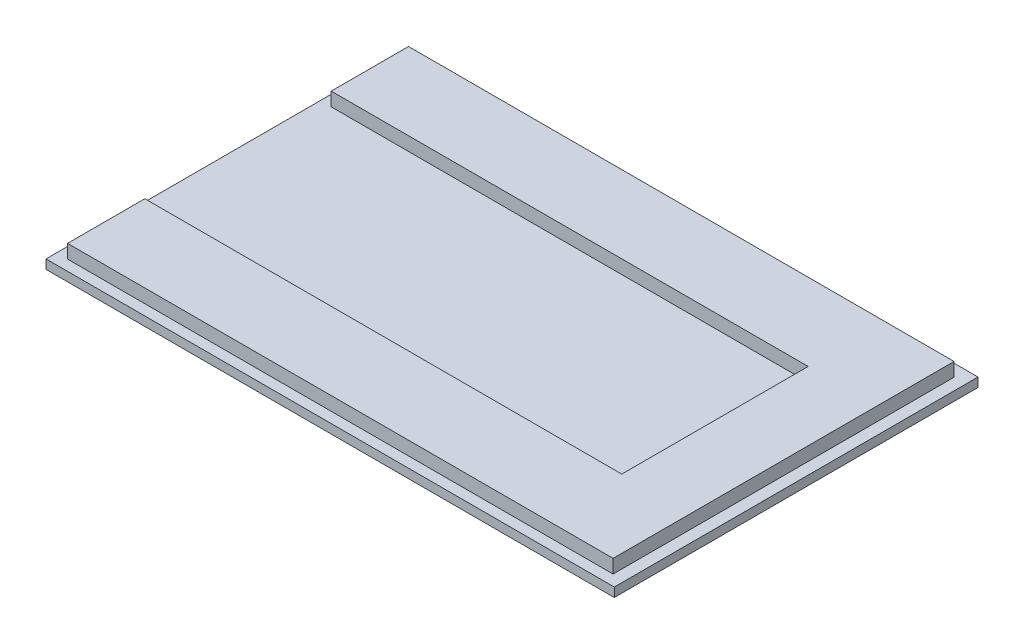
ISO-10303-21;
HEADER;
FILE_DESCRIPTION(('STEP AP214'),'2;1');
FILE_NAME('part.step','',(''),(''),'','','');
FILE_SCHEMA(('AUTOMOTIVE_DESIGN { 1 0 10303 214 1 1 1 1 }'));
ENDSEC;
DATA;
#1=APPLICATION_CONTEXT('core data for automotive mechanical design processes');
#2=APPLICATION_PROTOCOL_DEFINITION('international standard','automotive_design',2000,#1);
#3=PRODUCT_CONTEXT('',#1,'mechanical');
#4=PRODUCT('Part','Part','',(#3));
#5=PRODUCT_RELATED_PRODUCT_CATEGORY('part','',(#4));
#6=PRODUCT_DEFINITION_FORMATION('','',#4);
#7=PRODUCT_DEFINITION_CONTEXT('part definition',#1,'design');
#8=PRODUCT_DEFINITION('design','',#6,#7);
#9=PRODUCT_DEFINITION_SHAPE('','',#8);
#10=(LENGTH_UNIT() NAMED_UNIT(*) SI_UNIT(.MILLI.,.METRE.));
#11=(NAMED_UNIT(*) PLANE_ANGLE_UNIT() SI_UNIT($,.RADIAN.));
#12=(NAMED_UNIT(*) SI_UNIT($,.STERADIAN.) SOLID_ANGLE_UNIT());
#13=UNCERTAINTY_MEASURE_WITH_UNIT(LENGTH_MEASURE(1.E-05),#10,'distance_accuracy_value','');
#14=(GEOMETRIC_REPRESENTATION_CONTEXT(3) GLOBAL_UNCERTAINTY_ASSIGNED_CONTEXT((#13)) GLOBAL_UNIT_ASSIGNED_CONTEXT((#10,
#11,#12)) REPRESENTATION_CONTEXT('',''));
#15=CARTESIAN_POINT('',(0.,0.,0.));
#16=DIRECTION('',(0.,0.,1.));
#17=DIRECTION('',(1.,0.,0.));
#18=AXIS2_PLACEMENT_3D('',#15,#16,#17);
#19=CARTESIAN_POINT('',(2.40382047502787,5.,-77.3360349520913));
#20=DIRECTION('',(1.,0.,0.));
#21=DIRECTION('',(0.,0.,-1.));
#22=AXIS2_PLACEMENT_3D('',#19,#20,#21);
#23=PLANE('',#22);
#24=DIRECTION('',(0.,0.,1.));
#25=VECTOR('',#24,1.);
#26=CARTESIAN_POINT('',(2.40382047502787,2.,-77.3360349520913));
#27=LINE('',#26,#25);
#28=CARTESIAN_POINT('',(2.40382047502787,2.,-77.3360349520913));
#29=VERTEX_POINT('',#28);
#30=CARTESIAN_POINT('',(2.40382047502787,2.,-60.3360349520913));
#31=VERTEX_POINT('',#30);
#32=EDGE_CURVE('E56',#29,#31,#27,.T.);
#33=ORIENTED_EDGE('',*,*,#32,.T.);
#34=DIRECTION('',(0.,1.,0.));
#35=VECTOR('',#34,1.);
#36=CARTESIAN_POINT('',(2.40382047502787,2.,-60.3360349520913));
#37=LINE('',#36,#35);
#38=CARTESIAN_POINT('',(2.40382047502787,5.,-60.3360349520913));
#39=VERTEX_POINT('',#38);
#40=EDGE_CURVE('E144',#31,#39,#37,.T.);
#41=ORIENTED_EDGE('',*,*,#40,.T.);
#42=DIRECTION('',(0.,0.,1.));
#43=VECTOR('',#42,1.);
#44=CARTESIAN_POINT('',(2.40382047502787,5.,-77.3360349520913));
#45=LINE('',#44,#43);
#46=CARTESIAN_POINT('',(2.40382047502787,5.,-77.3360349520913));
#47=VERTEX_POINT('',#46);
#48=EDGE_CURVE('E333',#47,#39,#45,.T.);
#49=ORIENTED_EDGE('',*,*,#48,.F.);
#50=DIRECTION('',(0.,-1.,0.));
#51=VECTOR('',#50,1.);
#52=CARTESIAN_POINT('',(2.40382047502787,5.,-77.3360349520913));
#53=LINE('',#52,#51);
#54=EDGE_CURVE('E159',#47,#29,#53,.T.);
#55=ORIENTED_EDGE('',*,*,#54,.T.);
#56=EDGE_LOOP('',(#33,#41,#49,#55));
#57=FACE_BOUND('',#56,.T.);
#58=ADVANCED_FACE('F33',(#57),#23,.F.);
#59=CARTESIAN_POINT('',(0.,2.,0.));
#60=DIRECTION('',(0.,-1.,0.));
#61=DIRECTION('',(0.,0.,-1.));
#62=AXIS2_PLACEMENT_3D('',#59,#60,#61);
#63=PLANE('',#62);
#64=DIRECTION('',(0.,0.,1.));
#65=VECTOR('',#64,1.);
#66=CARTESIAN_POINT('',(0.,2.,0.));
#67=LINE('',#66,#65);
#68=CARTESIAN_POINT('',(0.,2.,-80.));
#69=VERTEX_POINT('',#68);
#70=CARTESIAN_POINT('',(0.,2.,0.));
#71=VERTEX_POINT('',#70);
#72=EDGE_CURVE('E171',#69,#71,#67,.T.);
#73=ORIENTED_EDGE('',*,*,#72,.T.);
#74=DIRECTION('',(1.,0.,0.));
#75=VECTOR('',#74,1.);
#76=CARTESIAN_POINT('',(0.,2.,0.));
#77=LINE('',#76,#75);
#78=CARTESIAN_POINT('',(125.,2.,0.));
#79=VERTEX_POINT('',#78);
#80=EDGE_CURVE('E174',#71,#79,#77,.T.);
#81=ORIENTED_EDGE('',*,*,#80,.T.);
#82=DIRECTION('',(0.,0.,-1.));
#83=VECTOR('',#82,1.);
#84=CARTESIAN_POINT('',(125.,2.,0.));
#85=LINE('',#84,#83);
#86=CARTESIAN_POINT('',(125.,2.,-80.));
#87=VERTEX_POINT('',#86);
#88=EDGE_CURVE('E177',#79,#87,#85,.T.);
#89=ORIENTED_EDGE('',*,*,#88,.T.);
#90=DIRECTION('',(-1.,0.,0.));
#91=VECTOR('',#90,1.);
#92=CARTESIAN_POINT('',(0.,2.,-80.));
#93=LINE('',#92,#91);
#94=EDGE_CURVE('E179',#87,#69,#93,.T.);
#95=ORIENTED_EDGE('',*,*,#94,.T.);
#96=EDGE_LOOP('',(#73,#81,#89,#95));
#97=FACE_BOUND('',#96,.T.);
#98=ORIENTED_EDGE('',*,*,#32,.F.);
#99=DIRECTION('',(-1.,0.,0.));
#100=VECTOR('',#99,1.);
#101=CARTESIAN_POINT('',(2.40382047502787,2.,-77.3360349520913));
#102=LINE('',#101,#100);
#103=CARTESIAN_POINT('',(122.403820475028,2.,-77.3360349520913));
#104=VERTEX_POINT('',#103);
#105=EDGE_CURVE('E157',#104,#29,#102,.T.);
#106=ORIENTED_EDGE('',*,*,#105,.F.);
#107=DIRECTION('',(0.,0.,-1.));
#108=VECTOR('',#107,1.);
#109=CARTESIAN_POINT('',(122.403820475028,2.,-77.3360349520913));
#110=LINE('',#109,#108);
#111=CARTESIAN_POINT('',(122.403820475028,2.,-2.33603495209132));
#112=VERTEX_POINT('',#111);
#113=EDGE_CURVE('E154',#112,#104,#110,.T.);
#114=ORIENTED_EDGE('',*,*,#113,.F.);
#115=DIRECTION('',(1.,0.,0.));
#116=VECTOR('',#115,1.);
#117=CARTESIAN_POINT('',(2.40382047502787,2.,-2.33603495209132));
#118=LINE('',#117,#116);
#119=CARTESIAN_POINT('',(2.40382047502787,2.,-2.33603495209132));
#120=VERTEX_POINT('',#119);
#121=EDGE_CURVE('E142',#120,#112,#118,.T.);
#122=ORIENTED_EDGE('',*,*,#121,.F.);
#123=CARTESIAN_POINT('',(2.40382047502787,2.,-19.3360349520913));
#124=VERTEX_POINT('',#123);
#125=EDGE_CURVE('E135',#124,#120,#27,.T.);
#126=ORIENTED_EDGE('',*,*,#125,.F.);
#127=DIRECTION('',(1.,0.,0.));
#128=VECTOR('',#127,1.);
#129=CARTESIAN_POINT('',(2.40382047502787,2.,-19.3360349520913));
#130=LINE('',#129,#128);
#131=CARTESIAN_POINT('',(107.308275896382,2.,-19.3360349520913));
#132=VERTEX_POINT('',#131);
#133=EDGE_CURVE('E122',#124,#132,#130,.T.);
#134=ORIENTED_EDGE('',*,*,#133,.T.);
#135=DIRECTION('',(0.,0.,-1.));
#136=VECTOR('',#135,1.);
#137=CARTESIAN_POINT('',(107.308275896382,2.,-60.3360349520913));
#138=LINE('',#137,#136);
#139=CARTESIAN_POINT('',(107.308275896382,2.,-60.3360349520913));
#140=VERTEX_POINT('',#139);
#141=EDGE_CURVE('E128',#132,#140,#138,.T.);
#142=ORIENTED_EDGE('',*,*,#141,.T.);
#143=DIRECTION('',(-1.,0.,0.));
#144=VECTOR('',#143,1.);
#145=CARTESIAN_POINT('',(2.40382047502787,2.,-60.3360349520913));
#146=LINE('',#145,#144);
#147=EDGE_CURVE('E138',#140,#31,#146,.T.);
#148=ORIENTED_EDGE('',*,*,#147,.T.);
#149=EDGE_LOOP('',(#98,#106,#114,#122,#126,#134,#142,#148));
#150=FACE_BOUND('',#149,.T.);
#151=ADVANCED_FACE('F140',(#97,#150),#63,.F.);
#152=CARTESIAN_POINT('',(0.,2.,0.));
#153=DIRECTION('',(1.,0.,0.));
#154=DIRECTION('',(0.,0.,-1.));
#155=AXIS2_PLACEMENT_3D('',#152,#153,#154);
#156=PLANE('',#155);
#157=DIRECTION('',(0.,0.,1.));
#158=VECTOR('',#157,1.);
#159=CARTESIAN_POINT('',(0.,0.,0.));
#160=LINE('',#159,#158);
#161=CARTESIAN_POINT('',(0.,0.,-80.));
#162=VERTEX_POINT('',#161);
#163=CARTESIAN_POINT('',(0.,0.,0.));
#164=VERTEX_POINT('',#163);
#165=EDGE_CURVE('E170',#162,#164,#160,.T.);
#166=ORIENTED_EDGE('',*,*,#165,.T.);
#167=DIRECTION('',(0.,-1.,0.));
#168=VECTOR('',#167,1.);
#169=CARTESIAN_POINT('',(0.,2.,0.));
#170=LINE('',#169,#168);
#171=EDGE_CURVE('E11',#71,#164,#170,.T.);
#172=ORIENTED_EDGE('',*,*,#171,.F.);
#173=ORIENTED_EDGE('',*,*,#72,.F.);
#174=DIRECTION('',(0.,-1.,0.));
#175=VECTOR('',#174,1.);
#176=CARTESIAN_POINT('',(0.,2.,-80.));
#177=LINE('',#176,#175);
#178=EDGE_CURVE('E181',#69,#162,#177,.T.);
#179=ORIENTED_EDGE('',*,*,#178,.T.);
#180=EDGE_LOOP('',(#166,#172,#173,#179));
#181=FACE_BOUND('',#180,.T.);
#182=ADVANCED_FACE('F35',(#181),#156,.F.);
#183=CARTESIAN_POINT('',(0.,2.,0.));
#184=DIRECTION('',(0.,0.,-1.));
#185=DIRECTION('',(-1.,0.,0.));
#186=AXIS2_PLACEMENT_3D('',#183,#184,#185);
#187=PLANE('',#186);
#188=DIRECTION('',(1.,0.,0.));
#189=VECTOR('',#188,1.);
#190=CARTESIAN_POINT('',(0.,0.,0.));
#191=LINE('',#190,#189);
#192=CARTESIAN_POINT('',(125.,0.,0.));
#193=VERTEX_POINT('',#192);
#194=EDGE_CURVE('E184',#164,#193,#191,.T.);
#195=ORIENTED_EDGE('',*,*,#194,.T.);
#196=DIRECTION('',(0.,-1.,0.));
#197=VECTOR('',#196,1.);
#198=CARTESIAN_POINT('',(125.,2.,0.));
#199=LINE('',#198,#197);
#200=EDGE_CURVE('E41',#79,#193,#199,.T.);
#201=ORIENTED_EDGE('',*,*,#200,.F.);
#202=ORIENTED_EDGE('',*,*,#80,.F.);
#203=ORIENTED_EDGE('',*,*,#171,.T.);
#204=EDGE_LOOP('',(#195,#201,#202,#203));
#205=FACE_BOUND('',#204,.T.);
#206=ADVANCED_FACE('F213',(#205),#187,.F.);
#207=CARTESIAN_POINT('',(125.,2.,0.));
#208=DIRECTION('',(-1.,0.,0.));
#209=DIRECTION('',(0.,0.,1.));
#210=AXIS2_PLACEMENT_3D('',#207,#208,#209);
#211=PLANE('',#210);
#212=DIRECTION('',(0.,0.,-1.));
#213=VECTOR('',#212,1.);
#214=CARTESIAN_POINT('',(125.,0.,0.));
#215=LINE('',#214,#213);
#216=CARTESIAN_POINT('',(125.,0.,-80.));
#217=VERTEX_POINT('',#216);
#218=EDGE_CURVE('E186',#193,#217,#215,.T.);
#219=ORIENTED_EDGE('',*,*,#218,.T.);
#220=DIRECTION('',(0.,-1.,0.));
#221=VECTOR('',#220,1.);
#222=CARTESIAN_POINT('',(125.,2.,-80.));
#223=LINE('',#222,#221);
#224=EDGE_CURVE('E191',#87,#217,#223,.T.);
#225=ORIENTED_EDGE('',*,*,#224,.F.);
#226=ORIENTED_EDGE('',*,*,#88,.F.);
#227=ORIENTED_EDGE('',*,*,#200,.T.);
#228=EDGE_LOOP('',(#219,#225,#226,#227));
#229=FACE_BOUND('',#228,.T.);
#230=ADVANCED_FACE('F198',(#229),#211,.F.);
#231=CARTESIAN_POINT('',(0.,2.,-80.));
#232=DIRECTION('',(0.,0.,1.));
#233=DIRECTION('',(1.,0.,0.));
#234=AXIS2_PLACEMENT_3D('',#231,#232,#233);
#235=PLANE('',#234);
#236=DIRECTION('',(-1.,0.,0.));
#237=VECTOR('',#236,1.);
#238=CARTESIAN_POINT('',(0.,0.,-80.));
#239=LINE('',#238,#237);
#240=EDGE_CURVE('E175',#217,#162,#239,.T.);
#241=ORIENTED_EDGE('',*,*,#240,.T.);
#242=ORIENTED_EDGE('',*,*,#178,.F.);
#243=ORIENTED_EDGE('',*,*,#94,.F.);
#244=ORIENTED_EDGE('',*,*,#224,.T.);
#245=EDGE_LOOP('',(#241,#242,#243,#244));
#246=FACE_BOUND('',#245,.T.);
#247=ADVANCED_FACE('F207',(#246),#235,.F.);
#248=CARTESIAN_POINT('',(0.,0.,0.));
#249=DIRECTION('',(0.,-1.,0.));
#250=DIRECTION('',(0.,0.,-1.));
#251=AXIS2_PLACEMENT_3D('',#248,#249,#250);
#252=PLANE('',#251);
#253=ORIENTED_EDGE('',*,*,#165,.F.);
#254=ORIENTED_EDGE('',*,*,#240,.F.);
#255=ORIENTED_EDGE('',*,*,#218,.F.);
#256=ORIENTED_EDGE('',*,*,#194,.F.);
#257=EDGE_LOOP('',(#253,#254,#255,#256));
#258=FACE_BOUND('',#257,.T.);
#259=ADVANCED_FACE('F204',(#258),#252,.T.);
#260=CARTESIAN_POINT('',(2.40382047502787,5.,-19.3360349520913));
#261=VERTEX_POINT('',#260);
#262=CARTESIAN_POINT('',(2.40382047502787,5.,-2.33603495209132));
#263=VERTEX_POINT('',#262);
#264=EDGE_CURVE('E137',#261,#263,#45,.T.);
#265=ORIENTED_EDGE('',*,*,#264,.F.);
#266=DIRECTION('',(0.,1.,0.));
#267=VECTOR('',#266,1.);
#268=CARTESIAN_POINT('',(2.40382047502787,2.,-19.3360349520913));
#269=LINE('',#268,#267);
#270=EDGE_CURVE('E48',#124,#261,#269,.T.);
#271=ORIENTED_EDGE('',*,*,#270,.F.);
#272=ORIENTED_EDGE('',*,*,#125,.T.);
#273=DIRECTION('',(0.,-1.,0.));
#274=VECTOR('',#273,1.);
#275=CARTESIAN_POINT('',(2.40382047502787,5.,-2.33603495209132));
#276=LINE('',#275,#274);
#277=EDGE_CURVE('E168',#263,#120,#276,.T.);
#278=ORIENTED_EDGE('',*,*,#277,.F.);
#279=EDGE_LOOP('',(#265,#271,#272,#278));
#280=FACE_BOUND('',#279,.T.);
#281=ADVANCED_FACE('F133',(#280),#23,.F.);
#282=CARTESIAN_POINT('',(2.40382047502787,5.,-2.33603495209132));
#283=DIRECTION('',(0.,0.,-1.));
#284=DIRECTION('',(-1.,0.,0.));
#285=AXIS2_PLACEMENT_3D('',#282,#283,#284);
#286=PLANE('',#285);
#287=ORIENTED_EDGE('',*,*,#121,.T.);
#288=DIRECTION('',(0.,-1.,0.));
#289=VECTOR('',#288,1.);
#290=CARTESIAN_POINT('',(122.403820475028,5.,-2.33603495209132));
#291=LINE('',#290,#289);
#292=CARTESIAN_POINT('',(122.403820475028,5.,-2.33603495209132));
#293=VERTEX_POINT('',#292);
#294=EDGE_CURVE('E165',#293,#112,#291,.T.);
#295=ORIENTED_EDGE('',*,*,#294,.F.);
#296=DIRECTION('',(1.,0.,0.));
#297=VECTOR('',#296,1.);
#298=CARTESIAN_POINT('',(2.40382047502787,5.,-2.33603495209132));
#299=LINE('',#298,#297);
#300=EDGE_CURVE('E332',#263,#293,#299,.T.);
#301=ORIENTED_EDGE('',*,*,#300,.F.);
#302=ORIENTED_EDGE('',*,*,#277,.T.);
#303=EDGE_LOOP('',(#287,#295,#301,#302));
#304=FACE_BOUND('',#303,.T.);
#305=ADVANCED_FACE('F229',(#304),#286,.F.);
#306=CARTESIAN_POINT('',(122.403820475028,5.,-77.3360349520913));
#307=DIRECTION('',(-1.,0.,0.));
#308=DIRECTION('',(0.,0.,1.));
#309=AXIS2_PLACEMENT_3D('',#306,#307,#308);
#310=PLANE('',#309);
#311=ORIENTED_EDGE('',*,*,#113,.T.);
#312=DIRECTION('',(0.,-1.,0.));
#313=VECTOR('',#312,1.);
#314=CARTESIAN_POINT('',(122.403820475028,5.,-77.3360349520913));
#315=LINE('',#314,#313);
#316=CARTESIAN_POINT('',(122.403820475028,5.,-77.3360349520913));
#317=VERTEX_POINT('',#316);
#318=EDGE_CURVE('E162',#317,#104,#315,.T.);
#319=ORIENTED_EDGE('',*,*,#318,.F.);
#320=DIRECTION('',(0.,0.,-1.));
#321=VECTOR('',#320,1.);
#322=CARTESIAN_POINT('',(122.403820475028,5.,-77.3360349520913));
#323=LINE('',#322,#321);
#324=EDGE_CURVE('E331',#293,#317,#323,.T.);
#325=ORIENTED_EDGE('',*,*,#324,.F.);
#326=ORIENTED_EDGE('',*,*,#294,.T.);
#327=EDGE_LOOP('',(#311,#319,#325,#326));
#328=FACE_BOUND('',#327,.T.);
#329=ADVANCED_FACE('F234',(#328),#310,.F.);
#330=CARTESIAN_POINT('',(2.40382047502787,5.,-77.3360349520913));
#331=DIRECTION('',(0.,0.,1.));
#332=DIRECTION('',(1.,0.,0.));
#333=AXIS2_PLACEMENT_3D('',#330,#331,#332);
#334=PLANE('',#333);
#335=ORIENTED_EDGE('',*,*,#105,.T.);
#336=ORIENTED_EDGE('',*,*,#54,.F.);
#337=DIRECTION('',(-1.,0.,0.));
#338=VECTOR('',#337,1.);
#339=CARTESIAN_POINT('',(2.40382047502787,5.,-77.3360349520913));
#340=LINE('',#339,#338);
#341=EDGE_CURVE('E151',#317,#47,#340,.T.);
#342=ORIENTED_EDGE('',*,*,#341,.F.);
#343=ORIENTED_EDGE('',*,*,#318,.T.);
#344=EDGE_LOOP('',(#335,#336,#342,#343));
#345=FACE_BOUND('',#344,.T.);
#346=ADVANCED_FACE('F284',(#345),#334,.F.);
#347=CARTESIAN_POINT('',(0.,5.,0.));
#348=DIRECTION('',(0.,1.,0.));
#349=DIRECTION('',(0.,0.,1.));
#350=AXIS2_PLACEMENT_3D('',#347,#348,#349);
#351=PLANE('',#350);
#352=DIRECTION('',(-1.,0.,0.));
#353=VECTOR('',#352,1.);
#354=CARTESIAN_POINT('',(2.40382047502787,5.,-60.3360349520913));
#355=LINE('',#354,#353);
#356=CARTESIAN_POINT('',(107.308275896382,5.,-60.3360349520913));
#357=VERTEX_POINT('',#356);
#358=EDGE_CURVE('E129',#357,#39,#355,.T.);
#359=ORIENTED_EDGE('',*,*,#358,.F.);
#360=DIRECTION('',(0.,0.,-1.));
#361=VECTOR('',#360,1.);
#362=CARTESIAN_POINT('',(107.308275896382,5.,-60.3360349520913));
#363=LINE('',#362,#361);
#364=CARTESIAN_POINT('',(107.308275896382,5.,-19.3360349520913));
#365=VERTEX_POINT('',#364);
#366=EDGE_CURVE('E340',#365,#357,#363,.T.);
#367=ORIENTED_EDGE('',*,*,#366,.F.);
#368=DIRECTION('',(1.,0.,0.));
#369=VECTOR('',#368,1.);
#370=CARTESIAN_POINT('',(2.40382047502787,5.,-19.3360349520913));
#371=LINE('',#370,#369);
#372=EDGE_CURVE('E343',#261,#365,#371,.T.);
#373=ORIENTED_EDGE('',*,*,#372,.F.);
#374=ORIENTED_EDGE('',*,*,#264,.T.);
#375=ORIENTED_EDGE('',*,*,#300,.T.);
#376=ORIENTED_EDGE('',*,*,#324,.T.);
#377=ORIENTED_EDGE('',*,*,#341,.T.);
#378=ORIENTED_EDGE('',*,*,#48,.T.);
#379=EDGE_LOOP('',(#359,#367,#373,#374,#375,#376,#377,#378));
#380=FACE_BOUND('',#379,.T.);
#381=ADVANCED_FACE('F278',(#380),#351,.T.);
#382=CARTESIAN_POINT('',(2.40382047502787,2.,-60.3360349520913));
#383=DIRECTION('',(0.,0.,-1.));
#384=DIRECTION('',(-1.,0.,0.));
#385=AXIS2_PLACEMENT_3D('',#382,#383,#384);
#386=PLANE('',#385);
#387=ORIENTED_EDGE('',*,*,#358,.T.);
#388=ORIENTED_EDGE('',*,*,#40,.F.);
#389=ORIENTED_EDGE('',*,*,#147,.F.);
#390=DIRECTION('',(0.,1.,0.));
#391=VECTOR('',#390,1.);
#392=CARTESIAN_POINT('',(107.308275896382,2.,-60.3360349520913));
#393=LINE('',#392,#391);
#394=EDGE_CURVE('E147',#140,#357,#393,.T.);
#395=ORIENTED_EDGE('',*,*,#394,.T.);
#396=EDGE_LOOP('',(#387,#388,#389,#395));
#397=FACE_BOUND('',#396,.T.);
#398=ADVANCED_FACE('F283',(#397),#386,.F.);
#399=CARTESIAN_POINT('',(107.308275896382,2.,-60.3360349520913));
#400=DIRECTION('',(1.,0.,0.));
#401=DIRECTION('',(0.,0.,-1.));
#402=AXIS2_PLACEMENT_3D('',#399,#400,#401);
#403=PLANE('',#402);
#404=ORIENTED_EDGE('',*,*,#366,.T.);
#405=ORIENTED_EDGE('',*,*,#394,.F.);
#406=ORIENTED_EDGE('',*,*,#141,.F.);
#407=DIRECTION('',(0.,1.,0.));
#408=VECTOR('',#407,1.);
#409=CARTESIAN_POINT('',(107.308275896382,2.,-19.3360349520913));
#410=LINE('',#409,#408);
#411=EDGE_CURVE('E124',#132,#365,#410,.T.);
#412=ORIENTED_EDGE('',*,*,#411,.T.);
#413=EDGE_LOOP('',(#404,#405,#406,#412));
#414=FACE_BOUND('',#413,.T.);
#415=ADVANCED_FACE('F295',(#414),#403,.F.);
#416=CARTESIAN_POINT('',(2.40382047502787,2.,-19.3360349520913));
#417=DIRECTION('',(0.,0.,1.));
#418=DIRECTION('',(1.,0.,0.));
#419=AXIS2_PLACEMENT_3D('',#416,#417,#418);
#420=PLANE('',#419);
#421=ORIENTED_EDGE('',*,*,#372,.T.);
#422=ORIENTED_EDGE('',*,*,#411,.F.);
#423=ORIENTED_EDGE('',*,*,#133,.F.);
#424=ORIENTED_EDGE('',*,*,#270,.T.);
#425=EDGE_LOOP('',(#421,#422,#423,#424));
#426=FACE_BOUND('',#425,.T.);
#427=ADVANCED_FACE('F123',(#426),#420,.F.);
#428=CLOSED_SHELL('',(#58,#151,#182,#206,#230,#247,#259,#281,#305,#329,#346,#381,#398,#415,#427));
#429=MANIFOLD_SOLID_BREP('B2',#428);
#430=ADVANCED_BREP_SHAPE_REPRESENTATION('',(#18,#429),#14);
#431=SHAPE_DEFINITION_REPRESENTATION(#9,#430);
ENDSEC;
END-ISO-10303-21;
